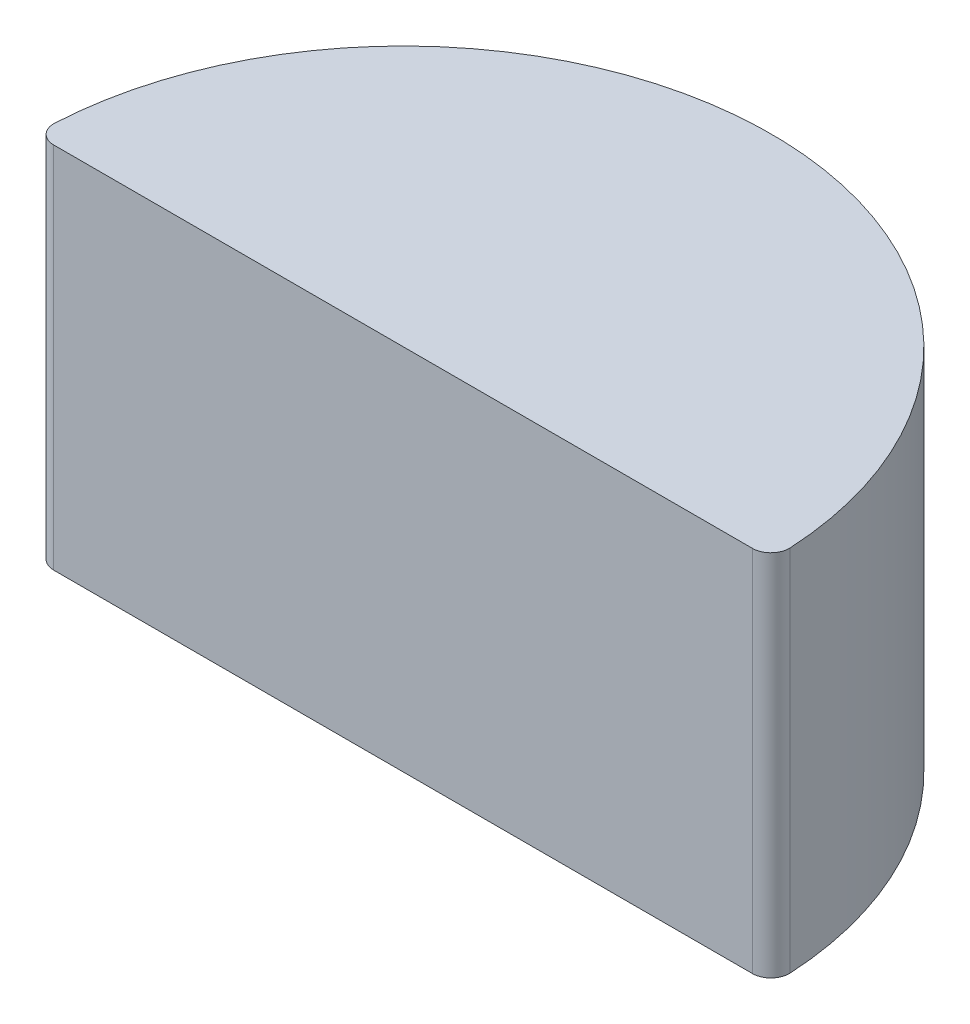
ISO-10303-21;
HEADER;
FILE_DESCRIPTION(('STEP AP214'),'2;1');
FILE_NAME('part.step','',(''),(''),'','','');
FILE_SCHEMA(('AUTOMOTIVE_DESIGN { 1 0 10303 214 1 1 1 1 }'));
ENDSEC;
DATA;
#1=APPLICATION_CONTEXT('core data for automotive mechanical design processes');
#2=APPLICATION_PROTOCOL_DEFINITION('international standard','automotive_design',2000,#1);
#3=PRODUCT_CONTEXT('',#1,'mechanical');
#4=PRODUCT('Part','Part','',(#3));
#5=PRODUCT_RELATED_PRODUCT_CATEGORY('part','',(#4));
#6=PRODUCT_DEFINITION_FORMATION('','',#4);
#7=PRODUCT_DEFINITION_CONTEXT('part definition',#1,'design');
#8=PRODUCT_DEFINITION('design','',#6,#7);
#9=PRODUCT_DEFINITION_SHAPE('','',#8);
#10=(LENGTH_UNIT() NAMED_UNIT(*) SI_UNIT(.MILLI.,.METRE.));
#11=(NAMED_UNIT(*) PLANE_ANGLE_UNIT() SI_UNIT($,.RADIAN.));
#12=(NAMED_UNIT(*) SI_UNIT($,.STERADIAN.) SOLID_ANGLE_UNIT());
#13=UNCERTAINTY_MEASURE_WITH_UNIT(LENGTH_MEASURE(1.E-05),#10,'distance_accuracy_value','');
#14=(GEOMETRIC_REPRESENTATION_CONTEXT(3) GLOBAL_UNCERTAINTY_ASSIGNED_CONTEXT((#13)) GLOBAL_UNIT_ASSIGNED_CONTEXT((#10,
#11,#12)) REPRESENTATION_CONTEXT('',''));
#15=CARTESIAN_POINT('',(0.,0.,0.));
#16=DIRECTION('',(0.,0.,1.));
#17=DIRECTION('',(1.,0.,0.));
#18=AXIS2_PLACEMENT_3D('',#15,#16,#17);
#19=CARTESIAN_POINT('',(20.,20.,0.));
#20=DIRECTION('',(0.,-1.,0.));
#21=DIRECTION('',(0.,0.,-1.));
#22=AXIS2_PLACEMENT_3D('',#19,#20,#21);
#23=CYLINDRICAL_SURFACE('',#22,20.);
#24=CARTESIAN_POINT('',(20.,20.,0.));
#25=DIRECTION('',(0.,1.,0.));
#26=DIRECTION('',(0.,0.,-1.));
#27=AXIS2_PLACEMENT_3D('',#24,#25,#26);
#28=CIRCLE('',#27,20.);
#29=CARTESIAN_POINT('',(39.9722799589582,20.,-1.05263157894737));
#30=VERTEX_POINT('',#29);
#31=CARTESIAN_POINT('',(0.0277200410418142,20.,-1.05263157894737));
#32=VERTEX_POINT('',#31);
#33=EDGE_CURVE('E90',#30,#32,#28,.T.);
#34=ORIENTED_EDGE('',*,*,#33,.F.);
#35=DIRECTION('',(0.,-1.,0.));
#36=VECTOR('',#35,1.);
#37=CARTESIAN_POINT('',(39.9722799589582,20.,-1.05263157894737));
#38=LINE('',#37,#36);
#39=CARTESIAN_POINT('',(39.9722799589582,0.,-1.05263157894737));
#40=VERTEX_POINT('',#39);
#41=EDGE_CURVE('E78',#30,#40,#38,.T.);
#42=ORIENTED_EDGE('',*,*,#41,.T.);
#43=CARTESIAN_POINT('',(20.,0.,0.));
#44=DIRECTION('',(0.,1.,0.));
#45=DIRECTION('',(0.,0.,-1.));
#46=AXIS2_PLACEMENT_3D('',#43,#44,#45);
#47=CIRCLE('',#46,20.);
#48=CARTESIAN_POINT('',(0.0277200410418142,0.,-1.05263157894737));
#49=VERTEX_POINT('',#48);
#50=EDGE_CURVE('E88',#40,#49,#47,.T.);
#51=ORIENTED_EDGE('',*,*,#50,.T.);
#52=DIRECTION('',(0.,-1.,0.));
#53=VECTOR('',#52,1.);
#54=CARTESIAN_POINT('',(0.0277200410418142,20.,-1.05263157894737));
#55=LINE('',#54,#53);
#56=EDGE_CURVE('E91',#49,#32,#55,.F.);
#57=ORIENTED_EDGE('',*,*,#56,.T.);
#58=EDGE_LOOP('',(#34,#42,#51,#57));
#59=FACE_BOUND('',#58,.T.);
#60=ADVANCED_FACE('F34',(#59),#23,.T.);
#61=CARTESIAN_POINT('',(0.,20.,0.));
#62=DIRECTION('',(0.,0.,-1.));
#63=DIRECTION('',(-1.,0.,0.));
#64=AXIS2_PLACEMENT_3D('',#61,#62,#63);
#65=PLANE('',#64);
#66=DIRECTION('',(1.,0.,0.));
#67=VECTOR('',#66,1.);
#68=CARTESIAN_POINT('',(0.,0.,0.));
#69=LINE('',#68,#67);
#70=CARTESIAN_POINT('',(1.02633403898972,0.,0.));
#71=VERTEX_POINT('',#70);
#72=CARTESIAN_POINT('',(38.9736659610103,0.,0.));
#73=VERTEX_POINT('',#72);
#74=EDGE_CURVE('E94',#71,#73,#69,.T.);
#75=ORIENTED_EDGE('',*,*,#74,.T.);
#76=DIRECTION('',(0.,-1.,0.));
#77=VECTOR('',#76,1.);
#78=CARTESIAN_POINT('',(38.9736659610103,20.,0.));
#79=LINE('',#78,#77);
#80=CARTESIAN_POINT('',(38.9736659610103,20.,0.));
#81=VERTEX_POINT('',#80);
#82=EDGE_CURVE('E49',#73,#81,#79,.F.);
#83=ORIENTED_EDGE('',*,*,#82,.T.);
#84=DIRECTION('',(1.,0.,0.));
#85=VECTOR('',#84,1.);
#86=CARTESIAN_POINT('',(0.,20.,0.));
#87=LINE('',#86,#85);
#88=CARTESIAN_POINT('',(1.02633403898972,20.,0.));
#89=VERTEX_POINT('',#88);
#90=EDGE_CURVE('E98',#89,#81,#87,.T.);
#91=ORIENTED_EDGE('',*,*,#90,.F.);
#92=DIRECTION('',(0.,-1.,0.));
#93=VECTOR('',#92,1.);
#94=CARTESIAN_POINT('',(1.02633403898972,20.,0.));
#95=LINE('',#94,#93);
#96=EDGE_CURVE('E82',#89,#71,#95,.T.);
#97=ORIENTED_EDGE('',*,*,#96,.T.);
#98=EDGE_LOOP('',(#75,#83,#91,#97));
#99=FACE_BOUND('',#98,.T.);
#100=ADVANCED_FACE('F106',(#99),#65,.F.);
#101=CARTESIAN_POINT('',(20.,20.,0.));
#102=DIRECTION('',(0.,-1.,0.));
#103=DIRECTION('',(0.,0.,-1.));
#104=AXIS2_PLACEMENT_3D('',#101,#102,#103);
#105=PLANE('',#104);
#106=ORIENTED_EDGE('',*,*,#90,.T.);
#107=CARTESIAN_POINT('',(38.9736659610103,20.,-1.));
#108=DIRECTION('',(0.,-1.,0.));
#109=DIRECTION('',(0.,0.,-1.));
#110=AXIS2_PLACEMENT_3D('',#107,#108,#109);
#111=CIRCLE('',#110,1.);
#112=EDGE_CURVE('E11',#81,#30,#111,.F.);
#113=ORIENTED_EDGE('',*,*,#112,.T.);
#114=ORIENTED_EDGE('',*,*,#33,.T.);
#115=CARTESIAN_POINT('',(1.02633403898972,20.,-1.));
#116=DIRECTION('',(0.,-1.,0.));
#117=DIRECTION('',(0.,0.,-1.));
#118=AXIS2_PLACEMENT_3D('',#115,#116,#117);
#119=CIRCLE('',#118,1.);
#120=EDGE_CURVE('E42',#32,#89,#119,.F.);
#121=ORIENTED_EDGE('',*,*,#120,.T.);
#122=EDGE_LOOP('',(#106,#113,#114,#121));
#123=FACE_BOUND('',#122,.T.);
#124=ADVANCED_FACE('F108',(#123),#105,.F.);
#125=CARTESIAN_POINT('',(20.,0.,0.));
#126=DIRECTION('',(0.,-1.,0.));
#127=DIRECTION('',(0.,0.,-1.));
#128=AXIS2_PLACEMENT_3D('',#125,#126,#127);
#129=PLANE('',#128);
#130=ORIENTED_EDGE('',*,*,#50,.F.);
#131=CARTESIAN_POINT('',(38.9736659610103,0.,-1.));
#132=DIRECTION('',(0.,-1.,0.));
#133=DIRECTION('',(0.,0.,-1.));
#134=AXIS2_PLACEMENT_3D('',#131,#132,#133);
#135=CIRCLE('',#134,1.);
#136=EDGE_CURVE('E74',#40,#73,#135,.T.);
#137=ORIENTED_EDGE('',*,*,#136,.T.);
#138=ORIENTED_EDGE('',*,*,#74,.F.);
#139=CARTESIAN_POINT('',(1.02633403898972,0.,-1.));
#140=DIRECTION('',(0.,-1.,0.));
#141=DIRECTION('',(0.,0.,-1.));
#142=AXIS2_PLACEMENT_3D('',#139,#140,#141);
#143=CIRCLE('',#142,1.);
#144=EDGE_CURVE('E83',#71,#49,#143,.T.);
#145=ORIENTED_EDGE('',*,*,#144,.T.);
#146=EDGE_LOOP('',(#130,#137,#138,#145));
#147=FACE_BOUND('',#146,.T.);
#148=ADVANCED_FACE('F93',(#147),#129,.T.);
#149=CARTESIAN_POINT('',(38.9736659610103,20.,-1.));
#150=DIRECTION('',(0.,-1.,0.));
#151=DIRECTION('',(0.,0.,-1.));
#152=AXIS2_PLACEMENT_3D('',#149,#150,#151);
#153=CYLINDRICAL_SURFACE('',#152,1.);
#154=ORIENTED_EDGE('',*,*,#112,.F.);
#155=ORIENTED_EDGE('',*,*,#82,.F.);
#156=ORIENTED_EDGE('',*,*,#136,.F.);
#157=ORIENTED_EDGE('',*,*,#41,.F.);
#158=EDGE_LOOP('',(#154,#155,#156,#157));
#159=FACE_BOUND('',#158,.T.);
#160=ADVANCED_FACE('F77',(#159),#153,.T.);
#161=CARTESIAN_POINT('',(1.02633403898972,20.,-1.));
#162=DIRECTION('',(0.,-1.,0.));
#163=DIRECTION('',(0.,0.,-1.));
#164=AXIS2_PLACEMENT_3D('',#161,#162,#163);
#165=CYLINDRICAL_SURFACE('',#164,1.);
#166=ORIENTED_EDGE('',*,*,#120,.F.);
#167=ORIENTED_EDGE('',*,*,#56,.F.);
#168=ORIENTED_EDGE('',*,*,#144,.F.);
#169=ORIENTED_EDGE('',*,*,#96,.F.);
#170=EDGE_LOOP('',(#166,#167,#168,#169));
#171=FACE_BOUND('',#170,.T.);
#172=ADVANCED_FACE('F36',(#171),#165,.T.);
#173=CLOSED_SHELL('',(#60,#100,#124,#148,#160,#172));
#174=MANIFOLD_SOLID_BREP('B2',#173);
#175=ADVANCED_BREP_SHAPE_REPRESENTATION('',(#18,#174),#14);
#176=SHAPE_DEFINITION_REPRESENTATION(#9,#175);
ENDSEC;
END-ISO-10303-21;
